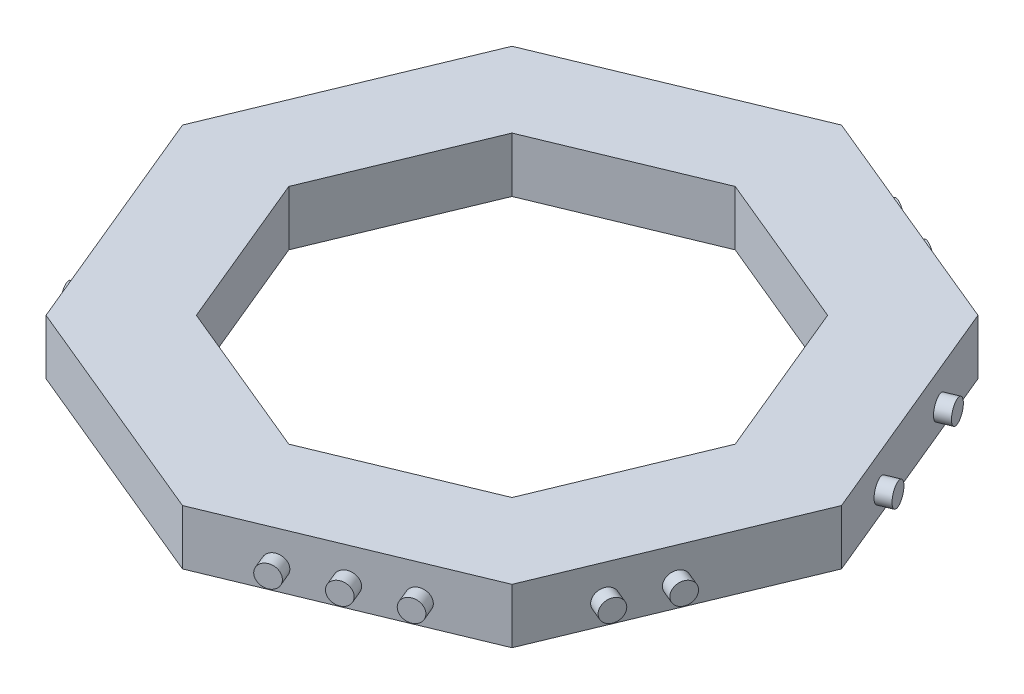
ISO-10303-21;
HEADER;
FILE_DESCRIPTION(('STEP AP214'),'2;1');
FILE_NAME('part.step','',(''),(''),'','','');
FILE_SCHEMA(('AUTOMOTIVE_DESIGN { 1 0 10303 214 1 1 1 1 }'));
ENDSEC;
DATA;
#1=APPLICATION_CONTEXT('core data for automotive mechanical design processes');
#2=APPLICATION_PROTOCOL_DEFINITION('international standard','automotive_design',2000,#1);
#3=PRODUCT_CONTEXT('',#1,'mechanical');
#4=PRODUCT('Part','Part','',(#3));
#5=PRODUCT_RELATED_PRODUCT_CATEGORY('part','',(#4));
#6=PRODUCT_DEFINITION_FORMATION('','',#4);
#7=PRODUCT_DEFINITION_CONTEXT('part definition',#1,'design');
#8=PRODUCT_DEFINITION('design','',#6,#7);
#9=PRODUCT_DEFINITION_SHAPE('','',#8);
#10=(LENGTH_UNIT() NAMED_UNIT(*) SI_UNIT(.MILLI.,.METRE.));
#11=(NAMED_UNIT(*) PLANE_ANGLE_UNIT() SI_UNIT($,.RADIAN.));
#12=(NAMED_UNIT(*) SI_UNIT($,.STERADIAN.) SOLID_ANGLE_UNIT());
#13=UNCERTAINTY_MEASURE_WITH_UNIT(LENGTH_MEASURE(1.E-05),#10,'distance_accuracy_value','');
#14=(GEOMETRIC_REPRESENTATION_CONTEXT(3) GLOBAL_UNCERTAINTY_ASSIGNED_CONTEXT((#13)) GLOBAL_UNIT_ASSIGNED_CONTEXT((#10,
#11,#12)) REPRESENTATION_CONTEXT('',''));
#15=CARTESIAN_POINT('',(0.,0.,0.));
#16=DIRECTION('',(0.,0.,1.));
#17=DIRECTION('',(1.,0.,0.));
#18=AXIS2_PLACEMENT_3D('',#15,#16,#17);
#19=CARTESIAN_POINT('',(21.2132034355967,5.,21.2132034355962));
#20=DIRECTION('',(-0.923879532511291,0.,-0.38268343236508));
#21=DIRECTION('',(-0.38268343236508,0.,0.923879532511291));
#22=AXIS2_PLACEMENT_3D('',#19,#20,#21);
#23=PLANE('',#22);
#24=CARTESIAN_POINT('',(25.6066017177983,2.,10.6066017177979));
#25=DIRECTION('',(-0.923879532511291,0.,-0.38268343236508));
#26=DIRECTION('',(-0.38268343236508,0.,0.923879532511291));
#27=AXIS2_PLACEMENT_3D('',#24,#25,#26);
#28=CIRCLE('',#27,1.);
#29=CARTESIAN_POINT('',(25.2239182854332,2.,11.5304812503092));
#30=VERTEX_POINT('',#29);
#31=EDGE_CURVE('E11',#30,#30,#28,.F.);
#32=ORIENTED_EDGE('',*,*,#31,.F.);
#33=EDGE_LOOP('',(#32));
#34=FACE_BOUND('',#33,.T.);
#35=CARTESIAN_POINT('',(23.6931845559729,2.,15.2259993803544));
#36=DIRECTION('',(-0.923879532511291,0.,-0.38268343236508));
#37=DIRECTION('',(-0.38268343236508,0.,0.923879532511291));
#38=AXIS2_PLACEMENT_3D('',#35,#36,#37);
#39=CIRCLE('',#38,1.);
#40=CARTESIAN_POINT('',(23.3105011236078,2.,16.1498789128657));
#41=VERTEX_POINT('',#40);
#42=EDGE_CURVE('E40',#41,#41,#39,.F.);
#43=ORIENTED_EDGE('',*,*,#42,.F.);
#44=EDGE_LOOP('',(#43));
#45=FACE_BOUND('',#44,.T.);
#46=DIRECTION('',(0.38268343236508,0.,-0.923879532511291));
#47=VECTOR('',#46,1.);
#48=CARTESIAN_POINT('',(21.2132034355967,0.,21.2132034355962));
#49=LINE('',#48,#47);
#50=CARTESIAN_POINT('',(21.2132034355967,0.,21.2132034355962));
#51=VERTEX_POINT('',#50);
#52=CARTESIAN_POINT('',(30.,0.,-3.27821759239711E-13));
#53=VERTEX_POINT('',#52);
#54=EDGE_CURVE('E205',#51,#53,#49,.T.);
#55=ORIENTED_EDGE('',*,*,#54,.T.);
#56=DIRECTION('',(0.,-1.,0.));
#57=VECTOR('',#56,1.);
#58=CARTESIAN_POINT('',(30.,5.,-3.27821759239711E-13));
#59=LINE('',#58,#57);
#60=CARTESIAN_POINT('',(30.,5.,-3.27821759239711E-13));
#61=VERTEX_POINT('',#60);
#62=EDGE_CURVE('E271',#61,#53,#59,.T.);
#63=ORIENTED_EDGE('',*,*,#62,.F.);
#64=DIRECTION('',(0.38268343236508,0.,-0.923879532511291));
#65=VECTOR('',#64,1.);
#66=CARTESIAN_POINT('',(21.2132034355967,5.,21.2132034355962));
#67=LINE('',#66,#65);
#68=CARTESIAN_POINT('',(21.2132034355967,5.,21.2132034355962));
#69=VERTEX_POINT('',#68);
#70=EDGE_CURVE('E217',#69,#61,#67,.T.);
#71=ORIENTED_EDGE('',*,*,#70,.F.);
#72=DIRECTION('',(0.,-1.,0.));
#73=VECTOR('',#72,1.);
#74=CARTESIAN_POINT('',(21.2132034355967,5.,21.2132034355962));
#75=LINE('',#74,#73);
#76=EDGE_CURVE('E235',#69,#51,#75,.T.);
#77=ORIENTED_EDGE('',*,*,#76,.T.);
#78=EDGE_LOOP('',(#55,#63,#71,#77));
#79=FACE_BOUND('',#78,.T.);
#80=ADVANCED_FACE('F33',(#34,#45,#79),#23,.F.);
#81=CARTESIAN_POINT('',(30.,5.,-3.27821759239711E-13));
#82=DIRECTION('',(-0.923879532511283,0.,0.3826834323651));
#83=DIRECTION('',(0.3826834323651,0.,0.923879532511283));
#84=AXIS2_PLACEMENT_3D('',#81,#82,#83);
#85=PLANE('',#84);
#86=CARTESIAN_POINT('',(23.6931845559726,2.,-15.2259993803549));
#87=DIRECTION('',(-0.923879532511283,0.,0.3826834323651));
#88=DIRECTION('',(0.3826834323651,0.,0.923879532511283));
#89=AXIS2_PLACEMENT_3D('',#86,#87,#88);
#90=CIRCLE('',#89,0.999999999999997);
#91=CARTESIAN_POINT('',(24.0758679883377,2.,-14.3021198478436));
#92=VERTEX_POINT('',#91);
#93=EDGE_CURVE('E301',#92,#92,#90,.F.);
#94=ORIENTED_EDGE('',*,*,#93,.F.);
#95=EDGE_LOOP('',(#94));
#96=FACE_BOUND('',#95,.T.);
#97=CARTESIAN_POINT('',(27.5200188796236,2.,-5.98720405524208));
#98=DIRECTION('',(-0.923879532511283,0.,0.3826834323651));
#99=DIRECTION('',(0.3826834323651,0.,0.923879532511283));
#100=AXIS2_PLACEMENT_3D('',#97,#98,#99);
#101=CIRCLE('',#100,1.);
#102=CARTESIAN_POINT('',(27.9027023119887,2.,-5.0633245227308));
#103=VERTEX_POINT('',#102);
#104=EDGE_CURVE('E298',#103,#103,#101,.F.);
#105=ORIENTED_EDGE('',*,*,#104,.F.);
#106=EDGE_LOOP('',(#105));
#107=FACE_BOUND('',#106,.T.);
#108=DIRECTION('',(-0.3826834323651,0.,-0.923879532511283));
#109=VECTOR('',#108,1.);
#110=CARTESIAN_POINT('',(30.,0.,-3.27821759239711E-13));
#111=LINE('',#110,#109);
#112=CARTESIAN_POINT('',(21.2132034355962,0.,-21.2132034355967));
#113=VERTEX_POINT('',#112);
#114=EDGE_CURVE('E238',#53,#113,#111,.T.);
#115=ORIENTED_EDGE('',*,*,#114,.T.);
#116=DIRECTION('',(0.,-1.,0.));
#117=VECTOR('',#116,1.);
#118=CARTESIAN_POINT('',(21.2132034355962,5.,-21.2132034355967));
#119=LINE('',#118,#117);
#120=CARTESIAN_POINT('',(21.2132034355962,5.,-21.2132034355967));
#121=VERTEX_POINT('',#120);
#122=EDGE_CURVE('E268',#121,#113,#119,.T.);
#123=ORIENTED_EDGE('',*,*,#122,.F.);
#124=DIRECTION('',(-0.3826834323651,0.,-0.923879532511283));
#125=VECTOR('',#124,1.);
#126=CARTESIAN_POINT('',(30.,5.,-3.27821759239711E-13));
#127=LINE('',#126,#125);
#128=EDGE_CURVE('E220',#61,#121,#127,.T.);
#129=ORIENTED_EDGE('',*,*,#128,.F.);
#130=ORIENTED_EDGE('',*,*,#62,.T.);
#131=EDGE_LOOP('',(#115,#123,#129,#130));
#132=FACE_BOUND('',#131,.T.);
#133=ADVANCED_FACE('F310',(#96,#107,#132),#85,.F.);
#134=CARTESIAN_POINT('',(21.2132034355962,5.,-21.2132034355967));
#135=DIRECTION('',(-0.382683432365079,0.,0.923879532511291));
#136=DIRECTION('',(0.923879532511291,0.,0.382683432365079));
#137=AXIS2_PLACEMENT_3D('',#134,#135,#136);
#138=PLANE('',#137);
#139=CARTESIAN_POINT('',(5.98720405524147,2.,-27.5200188796237));
#140=DIRECTION('',(-0.382683432365079,0.,0.923879532511291));
#141=DIRECTION('',(0.923879532511291,0.,0.382683432365079));
#142=AXIS2_PLACEMENT_3D('',#139,#140,#141);
#143=CIRCLE('',#142,1.);
#144=CARTESIAN_POINT('',(6.91108358775277,2.,-27.1373354472587));
#145=VERTEX_POINT('',#144);
#146=EDGE_CURVE('E295',#145,#145,#143,.F.);
#147=ORIENTED_EDGE('',*,*,#146,.F.);
#148=EDGE_LOOP('',(#147));
#149=FACE_BOUND('',#148,.T.);
#150=CARTESIAN_POINT('',(10.6066017177979,2.,-25.6066017177983));
#151=DIRECTION('',(-0.382683432365079,0.,0.923879532511291));
#152=DIRECTION('',(0.923879532511291,0.,0.382683432365079));
#153=AXIS2_PLACEMENT_3D('',#150,#151,#152);
#154=CIRCLE('',#153,1.);
#155=CARTESIAN_POINT('',(11.5304812503092,2.,-25.2239182854333));
#156=VERTEX_POINT('',#155);
#157=EDGE_CURVE('E292',#156,#156,#154,.F.);
#158=ORIENTED_EDGE('',*,*,#157,.F.);
#159=EDGE_LOOP('',(#158));
#160=FACE_BOUND('',#159,.T.);
#161=DIRECTION('',(-0.923879532511291,0.,-0.382683432365079));
#162=VECTOR('',#161,1.);
#163=CARTESIAN_POINT('',(21.2132034355962,0.,-21.2132034355967));
#164=LINE('',#163,#162);
#165=CARTESIAN_POINT('',(-3.33810454257589E-13,0.,-30.));
#166=VERTEX_POINT('',#165);
#167=EDGE_CURVE('E240',#113,#166,#164,.T.);
#168=ORIENTED_EDGE('',*,*,#167,.T.);
#169=DIRECTION('',(0.,-1.,0.));
#170=VECTOR('',#169,1.);
#171=CARTESIAN_POINT('',(-3.33810454257589E-13,5.,-30.));
#172=LINE('',#171,#170);
#173=CARTESIAN_POINT('',(-3.33810454257589E-13,5.,-30.));
#174=VERTEX_POINT('',#173);
#175=EDGE_CURVE('E265',#174,#166,#172,.T.);
#176=ORIENTED_EDGE('',*,*,#175,.F.);
#177=DIRECTION('',(-0.923879532511291,0.,-0.382683432365079));
#178=VECTOR('',#177,1.);
#179=CARTESIAN_POINT('',(21.2132034355962,5.,-21.2132034355967));
#180=LINE('',#179,#178);
#181=EDGE_CURVE('E223',#121,#174,#180,.T.);
#182=ORIENTED_EDGE('',*,*,#181,.F.);
#183=ORIENTED_EDGE('',*,*,#122,.T.);
#184=EDGE_LOOP('',(#168,#176,#182,#183));
#185=FACE_BOUND('',#184,.T.);
#186=ADVANCED_FACE('F348',(#149,#160,#185),#138,.F.);
#187=CARTESIAN_POINT('',(-3.33810454257589E-13,5.,-30.));
#188=DIRECTION('',(0.3826834323651,0.,0.923879532511283));
#189=DIRECTION('',(0.923879532511283,0.,-0.3826834323651));
#190=AXIS2_PLACEMENT_3D('',#187,#188,#189);
#191=PLANE('',#190);
#192=CARTESIAN_POINT('',(-5.98720405524208,2.,-27.5200188796236));
#193=DIRECTION('',(0.3826834323651,0.,0.923879532511283));
#194=DIRECTION('',(0.923879532511283,0.,-0.3826834323651));
#195=AXIS2_PLACEMENT_3D('',#192,#193,#194);
#196=CIRCLE('',#195,1.);
#197=CARTESIAN_POINT('',(-5.06332452273079,2.,-27.9027023119887));
#198=VERTEX_POINT('',#197);
#199=EDGE_CURVE('E289',#198,#198,#196,.F.);
#200=ORIENTED_EDGE('',*,*,#199,.F.);
#201=EDGE_LOOP('',(#200));
#202=FACE_BOUND('',#201,.T.);
#203=DIRECTION('',(-0.923879532511283,0.,0.3826834323651));
#204=VECTOR('',#203,1.);
#205=CARTESIAN_POINT('',(-3.33810454257589E-13,0.,-30.));
#206=LINE('',#205,#204);
#207=CARTESIAN_POINT('',(-21.2132034355967,0.,-21.2132034355962));
#208=VERTEX_POINT('',#207);
#209=EDGE_CURVE('E242',#166,#208,#206,.T.);
#210=ORIENTED_EDGE('',*,*,#209,.T.);
#211=DIRECTION('',(0.,-1.,0.));
#212=VECTOR('',#211,1.);
#213=CARTESIAN_POINT('',(-21.2132034355967,5.,-21.2132034355962));
#214=LINE('',#213,#212);
#215=CARTESIAN_POINT('',(-21.2132034355967,5.,-21.2132034355962));
#216=VERTEX_POINT('',#215);
#217=EDGE_CURVE('E262',#216,#208,#214,.T.);
#218=ORIENTED_EDGE('',*,*,#217,.F.);
#219=DIRECTION('',(-0.923879532511283,0.,0.3826834323651));
#220=VECTOR('',#219,1.);
#221=CARTESIAN_POINT('',(-3.33810454257589E-13,5.,-30.));
#222=LINE('',#221,#220);
#223=EDGE_CURVE('E225',#174,#216,#222,.T.);
#224=ORIENTED_EDGE('',*,*,#223,.F.);
#225=ORIENTED_EDGE('',*,*,#175,.T.);
#226=EDGE_LOOP('',(#210,#218,#224,#225));
#227=FACE_BOUND('',#226,.T.);
#228=ADVANCED_FACE('F345',(#202,#227),#191,.F.);
#229=CARTESIAN_POINT('',(-21.2132034355967,5.,-21.2132034355962));
#230=DIRECTION('',(0.923879532511291,0.,0.382683432365079));
#231=DIRECTION('',(0.382683432365079,0.,-0.923879532511291));
#232=AXIS2_PLACEMENT_3D('',#229,#230,#231);
#233=PLANE('',#232);
#234=CARTESIAN_POINT('',(-25.6066017177983,2.,-10.6066017177979));
#235=DIRECTION('',(0.923879532511291,0.,0.382683432365079));
#236=DIRECTION('',(0.382683432365079,0.,-0.923879532511291));
#237=AXIS2_PLACEMENT_3D('',#234,#235,#236);
#238=CIRCLE('',#237,1.);
#239=CARTESIAN_POINT('',(-25.2239182854333,2.,-11.5304812503092));
#240=VERTEX_POINT('',#239);
#241=EDGE_CURVE('E286',#240,#240,#238,.F.);
#242=ORIENTED_EDGE('',*,*,#241,.F.);
#243=EDGE_LOOP('',(#242));
#244=FACE_BOUND('',#243,.T.);
#245=DIRECTION('',(-0.382683432365079,0.,0.923879532511291));
#246=VECTOR('',#245,1.);
#247=CARTESIAN_POINT('',(-21.2132034355967,0.,-21.2132034355962));
#248=LINE('',#247,#246);
#249=CARTESIAN_POINT('',(-30.,0.,3.22876543822151E-13));
#250=VERTEX_POINT('',#249);
#251=EDGE_CURVE('E244',#208,#250,#248,.T.);
#252=ORIENTED_EDGE('',*,*,#251,.T.);
#253=DIRECTION('',(0.,-1.,0.));
#254=VECTOR('',#253,1.);
#255=CARTESIAN_POINT('',(-30.,5.,3.22876543822151E-13));
#256=LINE('',#255,#254);
#257=CARTESIAN_POINT('',(-30.,5.,3.22876543822151E-13));
#258=VERTEX_POINT('',#257);
#259=EDGE_CURVE('E259',#258,#250,#256,.T.);
#260=ORIENTED_EDGE('',*,*,#259,.F.);
#261=DIRECTION('',(-0.382683432365079,0.,0.923879532511291));
#262=VECTOR('',#261,1.);
#263=CARTESIAN_POINT('',(-21.2132034355967,5.,-21.2132034355962));
#264=LINE('',#263,#262);
#265=EDGE_CURVE('E227',#216,#258,#264,.T.);
#266=ORIENTED_EDGE('',*,*,#265,.F.);
#267=ORIENTED_EDGE('',*,*,#217,.T.);
#268=EDGE_LOOP('',(#252,#260,#266,#267));
#269=FACE_BOUND('',#268,.T.);
#270=ADVANCED_FACE('F341',(#244,#269),#233,.F.);
#271=CARTESIAN_POINT('',(-30.,5.,3.22876543822151E-13));
#272=DIRECTION('',(0.923879532511283,0.,-0.3826834323651));
#273=DIRECTION('',(-0.3826834323651,0.,-0.923879532511283));
#274=AXIS2_PLACEMENT_3D('',#271,#272,#273);
#275=PLANE('',#274);
#276=CARTESIAN_POINT('',(-23.6931845559726,2.,15.2259993803549));
#277=DIRECTION('',(0.923879532511283,0.,-0.3826834323651));
#278=DIRECTION('',(-0.3826834323651,0.,-0.923879532511283));
#279=AXIS2_PLACEMENT_3D('',#276,#277,#278);
#280=CIRCLE('',#279,1.);
#281=CARTESIAN_POINT('',(-24.0758679883377,2.,14.3021198478436));
#282=VERTEX_POINT('',#281);
#283=EDGE_CURVE('E283',#282,#282,#280,.F.);
#284=ORIENTED_EDGE('',*,*,#283,.F.);
#285=EDGE_LOOP('',(#284));
#286=FACE_BOUND('',#285,.T.);
#287=DIRECTION('',(0.3826834323651,0.,0.923879532511283));
#288=VECTOR('',#287,1.);
#289=CARTESIAN_POINT('',(-30.,0.,3.22876543822151E-13));
#290=LINE('',#289,#288);
#291=CARTESIAN_POINT('',(-21.2132034355962,0.,21.2132034355967));
#292=VERTEX_POINT('',#291);
#293=EDGE_CURVE('E246',#250,#292,#290,.T.);
#294=ORIENTED_EDGE('',*,*,#293,.T.);
#295=DIRECTION('',(0.,-1.,0.));
#296=VECTOR('',#295,1.);
#297=CARTESIAN_POINT('',(-21.2132034355962,5.,21.2132034355967));
#298=LINE('',#297,#296);
#299=CARTESIAN_POINT('',(-21.2132034355962,5.,21.2132034355967));
#300=VERTEX_POINT('',#299);
#301=EDGE_CURVE('E256',#300,#292,#298,.T.);
#302=ORIENTED_EDGE('',*,*,#301,.F.);
#303=DIRECTION('',(0.3826834323651,0.,0.923879532511283));
#304=VECTOR('',#303,1.);
#305=CARTESIAN_POINT('',(-30.,5.,3.22876543822151E-13));
#306=LINE('',#305,#304);
#307=EDGE_CURVE('E229',#258,#300,#306,.T.);
#308=ORIENTED_EDGE('',*,*,#307,.F.);
#309=ORIENTED_EDGE('',*,*,#259,.T.);
#310=EDGE_LOOP('',(#294,#302,#308,#309));
#311=FACE_BOUND('',#310,.T.);
#312=ADVANCED_FACE('F336',(#286,#311),#275,.F.);
#313=CARTESIAN_POINT('',(-21.2132034355962,5.,21.2132034355967));
#314=DIRECTION('',(0.382683432365079,0.,-0.923879532511291));
#315=DIRECTION('',(-0.923879532511291,0.,-0.382683432365079));
#316=AXIS2_PLACEMENT_3D('',#313,#314,#315);
#317=PLANE('',#316);
#318=DIRECTION('',(0.923879532511291,0.,0.382683432365079));
#319=VECTOR('',#318,1.);
#320=CARTESIAN_POINT('',(-21.2132034355962,0.,21.2132034355967));
#321=LINE('',#320,#319);
#322=CARTESIAN_POINT('',(3.27990907207669E-13,0.,30.));
#323=VERTEX_POINT('',#322);
#324=EDGE_CURVE('E248',#292,#323,#321,.T.);
#325=ORIENTED_EDGE('',*,*,#324,.T.);
#326=DIRECTION('',(0.,-1.,0.));
#327=VECTOR('',#326,1.);
#328=CARTESIAN_POINT('',(3.27990907207669E-13,5.,30.));
#329=LINE('',#328,#327);
#330=CARTESIAN_POINT('',(3.27990907207669E-13,5.,30.));
#331=VERTEX_POINT('',#330);
#332=EDGE_CURVE('E253',#331,#323,#329,.T.);
#333=ORIENTED_EDGE('',*,*,#332,.F.);
#334=DIRECTION('',(0.923879532511291,0.,0.382683432365079));
#335=VECTOR('',#334,1.);
#336=CARTESIAN_POINT('',(-21.2132034355962,5.,21.2132034355967));
#337=LINE('',#336,#335);
#338=EDGE_CURVE('E231',#300,#331,#337,.T.);
#339=ORIENTED_EDGE('',*,*,#338,.F.);
#340=ORIENTED_EDGE('',*,*,#301,.T.);
#341=EDGE_LOOP('',(#325,#333,#339,#340));
#342=FACE_BOUND('',#341,.T.);
#343=ADVANCED_FACE('F331',(#342),#317,.F.);
#344=CARTESIAN_POINT('',(3.27990907207669E-13,5.,30.));
#345=DIRECTION('',(-0.3826834323651,0.,-0.923879532511283));
#346=DIRECTION('',(-0.923879532511283,0.,0.3826834323651));
#347=AXIS2_PLACEMENT_3D('',#344,#345,#346);
#348=PLANE('',#347);
#349=CARTESIAN_POINT('',(10.6066017177985,2.,25.6066017177981));
#350=DIRECTION('',(-0.3826834323651,0.,-0.923879532511283));
#351=DIRECTION('',(-0.923879532511283,0.,0.3826834323651));
#352=AXIS2_PLACEMENT_3D('',#349,#350,#351);
#353=CIRCLE('',#352,1.);
#354=CARTESIAN_POINT('',(9.6827221852872,2.,25.9892851501632));
#355=VERTEX_POINT('',#354);
#356=EDGE_CURVE('E280',#355,#355,#353,.F.);
#357=ORIENTED_EDGE('',*,*,#356,.F.);
#358=EDGE_LOOP('',(#357));
#359=FACE_BOUND('',#358,.T.);
#360=CARTESIAN_POINT('',(5.98720405524207,2.,27.5200188796236));
#361=DIRECTION('',(-0.3826834323651,0.,-0.923879532511283));
#362=DIRECTION('',(-0.923879532511283,0.,0.3826834323651));
#363=AXIS2_PLACEMENT_3D('',#360,#361,#362);
#364=CIRCLE('',#363,1.);
#365=CARTESIAN_POINT('',(5.06332452273079,2.,27.9027023119887));
#366=VERTEX_POINT('',#365);
#367=EDGE_CURVE('E277',#366,#366,#364,.F.);
#368=ORIENTED_EDGE('',*,*,#367,.F.);
#369=EDGE_LOOP('',(#368));
#370=FACE_BOUND('',#369,.T.);
#371=CARTESIAN_POINT('',(15.2259993803549,2.,23.6931845559726));
#372=DIRECTION('',(-0.3826834323651,0.,-0.923879532511283));
#373=DIRECTION('',(-0.923879532511283,0.,0.3826834323651));
#374=AXIS2_PLACEMENT_3D('',#371,#372,#373);
#375=CIRCLE('',#374,0.999999999999997);
#376=CARTESIAN_POINT('',(14.3021198478436,2.,24.0758679883377));
#377=VERTEX_POINT('',#376);
#378=EDGE_CURVE('E274',#377,#377,#375,.F.);
#379=ORIENTED_EDGE('',*,*,#378,.F.);
#380=EDGE_LOOP('',(#379));
#381=FACE_BOUND('',#380,.T.);
#382=DIRECTION('',(0.923879532511283,0.,-0.3826834323651));
#383=VECTOR('',#382,1.);
#384=CARTESIAN_POINT('',(3.27990907207669E-13,0.,30.));
#385=LINE('',#384,#383);
#386=EDGE_CURVE('E221',#323,#51,#385,.T.);
#387=ORIENTED_EDGE('',*,*,#386,.T.);
#388=ORIENTED_EDGE('',*,*,#76,.F.);
#389=DIRECTION('',(0.923879532511283,0.,-0.3826834323651));
#390=VECTOR('',#389,1.);
#391=CARTESIAN_POINT('',(3.27990907207669E-13,5.,30.));
#392=LINE('',#391,#390);
#393=EDGE_CURVE('E233',#331,#69,#392,.T.);
#394=ORIENTED_EDGE('',*,*,#393,.F.);
#395=ORIENTED_EDGE('',*,*,#332,.T.);
#396=EDGE_LOOP('',(#387,#388,#394,#395));
#397=FACE_BOUND('',#396,.T.);
#398=ADVANCED_FACE('F329',(#359,#370,#381,#397),#348,.F.);
#399=CARTESIAN_POINT('',(0.,5.,0.));
#400=DIRECTION('',(0.,1.,0.));
#401=DIRECTION('',(0.,0.,1.));
#402=AXIS2_PLACEMENT_3D('',#399,#400,#401);
#403=PLANE('',#402);
#404=DIRECTION('',(0.382683432365079,0.,-0.923879532511291));
#405=VECTOR('',#404,1.);
#406=CARTESIAN_POINT('',(14.3684097937108,5.,14.3684097937105));
#407=LINE('',#406,#405);
#408=CARTESIAN_POINT('',(14.3684097937108,5.,14.3684097937105));
#409=VERTEX_POINT('',#408);
#410=CARTESIAN_POINT('',(20.32,5.,-2.38524477946811E-13));
#411=VERTEX_POINT('',#410);
#412=EDGE_CURVE('E47',#409,#411,#407,.T.);
#413=ORIENTED_EDGE('',*,*,#412,.F.);
#414=DIRECTION('',(0.923879532511282,0.,-0.3826834323651));
#415=VECTOR('',#414,1.);
#416=CARTESIAN_POINT('',(2.40678638717616E-13,5.,20.32));
#417=LINE('',#416,#415);
#418=CARTESIAN_POINT('',(2.40678638717616E-13,5.,20.32));
#419=VERTEX_POINT('',#418);
#420=EDGE_CURVE('E164',#419,#409,#417,.T.);
#421=ORIENTED_EDGE('',*,*,#420,.F.);
#422=DIRECTION('',(0.923879532511291,0.,0.382683432365079));
#423=VECTOR('',#422,1.);
#424=CARTESIAN_POINT('',(-14.3684097937105,5.,14.3684097937108));
#425=LINE('',#424,#423);
#426=CARTESIAN_POINT('',(-14.3684097937105,5.,14.3684097937108));
#427=VERTEX_POINT('',#426);
#428=EDGE_CURVE('E167',#427,#419,#425,.T.);
#429=ORIENTED_EDGE('',*,*,#428,.F.);
#430=DIRECTION('',(0.3826834323651,0.,0.923879532511282));
#431=VECTOR('',#430,1.);
#432=CARTESIAN_POINT('',(-20.32,5.,2.42729561305328E-13));
#433=LINE('',#432,#431);
#434=CARTESIAN_POINT('',(-20.32,5.,2.42729561305328E-13));
#435=VERTEX_POINT('',#434);
#436=EDGE_CURVE('E198',#435,#427,#433,.T.);
#437=ORIENTED_EDGE('',*,*,#436,.F.);
#438=DIRECTION('',(-0.382683432365079,0.,0.923879532511291));
#439=VECTOR('',#438,1.);
#440=CARTESIAN_POINT('',(-14.3684097937108,5.,-14.3684097937105));
#441=LINE('',#440,#439);
#442=CARTESIAN_POINT('',(-14.3684097937108,5.,-14.3684097937105));
#443=VERTEX_POINT('',#442);
#444=EDGE_CURVE('E195',#443,#435,#441,.T.);
#445=ORIENTED_EDGE('',*,*,#444,.F.);
#446=DIRECTION('',(-0.923879532511282,0.,0.3826834323651));
#447=VECTOR('',#446,1.);
#448=CARTESIAN_POINT('',(-2.42838850685979E-13,5.,-20.32));
#449=LINE('',#448,#447);
#450=CARTESIAN_POINT('',(-2.42838850685979E-13,5.,-20.32));
#451=VERTEX_POINT('',#450);
#452=EDGE_CURVE('E192',#451,#443,#449,.T.);
#453=ORIENTED_EDGE('',*,*,#452,.F.);
#454=DIRECTION('',(-0.923879532511291,0.,-0.382683432365079));
#455=VECTOR('',#454,1.);
#456=CARTESIAN_POINT('',(14.3684097937105,5.,-14.3684097937108));
#457=LINE('',#456,#455);
#458=CARTESIAN_POINT('',(14.3684097937105,5.,-14.3684097937108));
#459=VERTEX_POINT('',#458);
#460=EDGE_CURVE('E189',#459,#451,#457,.T.);
#461=ORIENTED_EDGE('',*,*,#460,.F.);
#462=DIRECTION('',(-0.382683432365101,0.,-0.923879532511282));
#463=VECTOR('',#462,1.);
#464=CARTESIAN_POINT('',(20.32,5.,-2.3879865158925E-13));
#465=LINE('',#464,#463);
#466=EDGE_CURVE('E187',#411,#459,#465,.T.);
#467=ORIENTED_EDGE('',*,*,#466,.F.);
#468=EDGE_LOOP('',(#413,#421,#429,#437,#445,#453,#461,#467));
#469=FACE_BOUND('',#468,.T.);
#470=ORIENTED_EDGE('',*,*,#70,.T.);
#471=ORIENTED_EDGE('',*,*,#128,.T.);
#472=ORIENTED_EDGE('',*,*,#181,.T.);
#473=ORIENTED_EDGE('',*,*,#223,.T.);
#474=ORIENTED_EDGE('',*,*,#265,.T.);
#475=ORIENTED_EDGE('',*,*,#307,.T.);
#476=ORIENTED_EDGE('',*,*,#338,.T.);
#477=ORIENTED_EDGE('',*,*,#393,.T.);
#478=EDGE_LOOP('',(#470,#471,#472,#473,#474,#475,#476,#477));
#479=FACE_BOUND('',#478,.T.);
#480=ADVANCED_FACE('F324',(#469,#479),#403,.T.);
#481=CARTESIAN_POINT('',(0.,0.,0.));
#482=DIRECTION('',(0.,1.,0.));
#483=DIRECTION('',(0.,0.,1.));
#484=AXIS2_PLACEMENT_3D('',#481,#482,#483);
#485=PLANE('',#484);
#486=DIRECTION('',(0.923879532511282,0.,-0.3826834323651));
#487=VECTOR('',#486,1.);
#488=CARTESIAN_POINT('',(2.40678638717616E-13,0.,20.32));
#489=LINE('',#488,#487);
#490=CARTESIAN_POINT('',(2.40678638717616E-13,0.,20.32));
#491=VERTEX_POINT('',#490);
#492=CARTESIAN_POINT('',(14.3684097937108,0.,14.3684097937105));
#493=VERTEX_POINT('',#492);
#494=EDGE_CURVE('E153',#491,#493,#489,.T.);
#495=ORIENTED_EDGE('',*,*,#494,.T.);
#496=DIRECTION('',(0.382683432365079,0.,-0.923879532511291));
#497=VECTOR('',#496,1.);
#498=CARTESIAN_POINT('',(14.3684097937108,0.,14.3684097937105));
#499=LINE('',#498,#497);
#500=CARTESIAN_POINT('',(20.32,0.,-2.3879865158925E-13));
#501=VERTEX_POINT('',#500);
#502=EDGE_CURVE('E147',#493,#501,#499,.T.);
#503=ORIENTED_EDGE('',*,*,#502,.T.);
#504=DIRECTION('',(-0.382683432365101,0.,-0.923879532511282));
#505=VECTOR('',#504,1.);
#506=CARTESIAN_POINT('',(20.32,0.,-2.3879865158925E-13));
#507=LINE('',#506,#505);
#508=CARTESIAN_POINT('',(14.3684097937105,0.,-14.3684097937108));
#509=VERTEX_POINT('',#508);
#510=EDGE_CURVE('E156',#501,#509,#507,.T.);
#511=ORIENTED_EDGE('',*,*,#510,.T.);
#512=DIRECTION('',(-0.923879532511291,0.,-0.382683432365079));
#513=VECTOR('',#512,1.);
#514=CARTESIAN_POINT('',(14.3684097937105,0.,-14.3684097937108));
#515=LINE('',#514,#513);
#516=CARTESIAN_POINT('',(-2.42838850685979E-13,0.,-20.32));
#517=VERTEX_POINT('',#516);
#518=EDGE_CURVE('E55',#509,#517,#515,.T.);
#519=ORIENTED_EDGE('',*,*,#518,.T.);
#520=DIRECTION('',(-0.923879532511282,0.,0.3826834323651));
#521=VECTOR('',#520,1.);
#522=CARTESIAN_POINT('',(-2.42838850685979E-13,0.,-20.32));
#523=LINE('',#522,#521);
#524=CARTESIAN_POINT('',(-14.3684097937108,0.,-14.3684097937105));
#525=VERTEX_POINT('',#524);
#526=EDGE_CURVE('E174',#517,#525,#523,.T.);
#527=ORIENTED_EDGE('',*,*,#526,.T.);
#528=DIRECTION('',(-0.382683432365079,0.,0.923879532511291));
#529=VECTOR('',#528,1.);
#530=CARTESIAN_POINT('',(-14.3684097937108,0.,-14.3684097937105));
#531=LINE('',#530,#529);
#532=CARTESIAN_POINT('',(-20.32,0.,2.42729561305328E-13));
#533=VERTEX_POINT('',#532);
#534=EDGE_CURVE('E177',#525,#533,#531,.T.);
#535=ORIENTED_EDGE('',*,*,#534,.T.);
#536=DIRECTION('',(0.3826834323651,0.,0.923879532511282));
#537=VECTOR('',#536,1.);
#538=CARTESIAN_POINT('',(-20.32,0.,2.42729561305328E-13));
#539=LINE('',#538,#537);
#540=CARTESIAN_POINT('',(-14.3684097937105,0.,14.3684097937108));
#541=VERTEX_POINT('',#540);
#542=EDGE_CURVE('E180',#533,#541,#539,.T.);
#543=ORIENTED_EDGE('',*,*,#542,.T.);
#544=DIRECTION('',(0.923879532511291,0.,0.382683432365079));
#545=VECTOR('',#544,1.);
#546=CARTESIAN_POINT('',(-14.3684097937105,0.,14.3684097937108));
#547=LINE('',#546,#545);
#548=EDGE_CURVE('E183',#541,#491,#547,.T.);
#549=ORIENTED_EDGE('',*,*,#548,.T.);
#550=EDGE_LOOP('',(#495,#503,#511,#519,#527,#535,#543,#549));
#551=FACE_BOUND('',#550,.T.);
#552=ORIENTED_EDGE('',*,*,#54,.F.);
#553=ORIENTED_EDGE('',*,*,#386,.F.);
#554=ORIENTED_EDGE('',*,*,#324,.F.);
#555=ORIENTED_EDGE('',*,*,#293,.F.);
#556=ORIENTED_EDGE('',*,*,#251,.F.);
#557=ORIENTED_EDGE('',*,*,#209,.F.);
#558=ORIENTED_EDGE('',*,*,#167,.F.);
#559=ORIENTED_EDGE('',*,*,#114,.F.);
#560=EDGE_LOOP('',(#552,#553,#554,#555,#556,#557,#558,#559));
#561=FACE_BOUND('',#560,.T.);
#562=ADVANCED_FACE('F160',(#551,#561),#485,.F.);
#563=CARTESIAN_POINT('',(14.3684097937108,0.,14.3684097937105));
#564=DIRECTION('',(0.923879532511291,0.,0.382683432365079));
#565=DIRECTION('',(0.382683432365079,0.,-0.923879532511291));
#566=AXIS2_PLACEMENT_3D('',#563,#564,#565);
#567=PLANE('',#566);
#568=ORIENTED_EDGE('',*,*,#412,.T.);
#569=DIRECTION('',(0.,1.,0.));
#570=VECTOR('',#569,1.);
#571=CARTESIAN_POINT('',(20.32,0.,-2.3879865158925E-13));
#572=LINE('',#571,#570);
#573=EDGE_CURVE('E143',#501,#411,#572,.T.);
#574=ORIENTED_EDGE('',*,*,#573,.F.);
#575=ORIENTED_EDGE('',*,*,#502,.F.);
#576=DIRECTION('',(0.,1.,0.));
#577=VECTOR('',#576,1.);
#578=CARTESIAN_POINT('',(14.3684097937108,0.,14.3684097937105));
#579=LINE('',#578,#577);
#580=EDGE_CURVE('E203',#493,#409,#579,.T.);
#581=ORIENTED_EDGE('',*,*,#580,.T.);
#582=EDGE_LOOP('',(#568,#574,#575,#581));
#583=FACE_BOUND('',#582,.T.);
#584=ADVANCED_FACE('F145',(#583),#567,.F.);
#585=CARTESIAN_POINT('',(2.40678638717616E-13,0.,20.32));
#586=DIRECTION('',(0.3826834323651,0.,0.923879532511282));
#587=DIRECTION('',(0.923879532511282,0.,-0.3826834323651));
#588=AXIS2_PLACEMENT_3D('',#585,#586,#587);
#589=PLANE('',#588);
#590=ORIENTED_EDGE('',*,*,#420,.T.);
#591=ORIENTED_EDGE('',*,*,#580,.F.);
#592=ORIENTED_EDGE('',*,*,#494,.F.);
#593=DIRECTION('',(0.,1.,0.));
#594=VECTOR('',#593,1.);
#595=CARTESIAN_POINT('',(2.40678638717616E-13,0.,20.32));
#596=LINE('',#595,#594);
#597=EDGE_CURVE('E206',#491,#419,#596,.T.);
#598=ORIENTED_EDGE('',*,*,#597,.T.);
#599=EDGE_LOOP('',(#590,#591,#592,#598));
#600=FACE_BOUND('',#599,.T.);
#601=ADVANCED_FACE('F380',(#600),#589,.F.);
#602=CARTESIAN_POINT('',(-14.3684097937105,0.,14.3684097937108));
#603=DIRECTION('',(-0.382683432365079,0.,0.923879532511291));
#604=DIRECTION('',(0.923879532511291,0.,0.382683432365079));
#605=AXIS2_PLACEMENT_3D('',#602,#603,#604);
#606=PLANE('',#605);
#607=ORIENTED_EDGE('',*,*,#428,.T.);
#608=ORIENTED_EDGE('',*,*,#597,.F.);
#609=ORIENTED_EDGE('',*,*,#548,.F.);
#610=DIRECTION('',(0.,1.,0.));
#611=VECTOR('',#610,1.);
#612=CARTESIAN_POINT('',(-14.3684097937105,0.,14.3684097937108));
#613=LINE('',#612,#611);
#614=EDGE_CURVE('E208',#541,#427,#613,.T.);
#615=ORIENTED_EDGE('',*,*,#614,.T.);
#616=EDGE_LOOP('',(#607,#608,#609,#615));
#617=FACE_BOUND('',#616,.T.);
#618=ADVANCED_FACE('F398',(#617),#606,.F.);
#619=CARTESIAN_POINT('',(-20.32,0.,2.42729561305328E-13));
#620=DIRECTION('',(-0.923879532511282,0.,0.3826834323651));
#621=DIRECTION('',(0.3826834323651,0.,0.923879532511282));
#622=AXIS2_PLACEMENT_3D('',#619,#620,#621);
#623=PLANE('',#622);
#624=ORIENTED_EDGE('',*,*,#436,.T.);
#625=ORIENTED_EDGE('',*,*,#614,.F.);
#626=ORIENTED_EDGE('',*,*,#542,.F.);
#627=DIRECTION('',(0.,1.,0.));
#628=VECTOR('',#627,1.);
#629=CARTESIAN_POINT('',(-20.32,0.,2.42729561305328E-13));
#630=LINE('',#629,#628);
#631=EDGE_CURVE('E210',#533,#435,#630,.T.);
#632=ORIENTED_EDGE('',*,*,#631,.T.);
#633=EDGE_LOOP('',(#624,#625,#626,#632));
#634=FACE_BOUND('',#633,.T.);
#635=ADVANCED_FACE('F394',(#634),#623,.F.);
#636=CARTESIAN_POINT('',(-14.3684097937108,0.,-14.3684097937105));
#637=DIRECTION('',(-0.923879532511291,0.,-0.382683432365079));
#638=DIRECTION('',(-0.382683432365079,0.,0.923879532511291));
#639=AXIS2_PLACEMENT_3D('',#636,#637,#638);
#640=PLANE('',#639);
#641=ORIENTED_EDGE('',*,*,#444,.T.);
#642=ORIENTED_EDGE('',*,*,#631,.F.);
#643=ORIENTED_EDGE('',*,*,#534,.F.);
#644=DIRECTION('',(0.,1.,0.));
#645=VECTOR('',#644,1.);
#646=CARTESIAN_POINT('',(-14.3684097937108,0.,-14.3684097937105));
#647=LINE('',#646,#645);
#648=EDGE_CURVE('E212',#525,#443,#647,.T.);
#649=ORIENTED_EDGE('',*,*,#648,.T.);
#650=EDGE_LOOP('',(#641,#642,#643,#649));
#651=FACE_BOUND('',#650,.T.);
#652=ADVANCED_FACE('F390',(#651),#640,.F.);
#653=CARTESIAN_POINT('',(-2.42838850685979E-13,0.,-20.32));
#654=DIRECTION('',(-0.3826834323651,0.,-0.923879532511282));
#655=DIRECTION('',(-0.923879532511282,0.,0.3826834323651));
#656=AXIS2_PLACEMENT_3D('',#653,#654,#655);
#657=PLANE('',#656);
#658=ORIENTED_EDGE('',*,*,#452,.T.);
#659=ORIENTED_EDGE('',*,*,#648,.F.);
#660=ORIENTED_EDGE('',*,*,#526,.F.);
#661=DIRECTION('',(0.,1.,0.));
#662=VECTOR('',#661,1.);
#663=CARTESIAN_POINT('',(-2.42838850685979E-13,0.,-20.32));
#664=LINE('',#663,#662);
#665=EDGE_CURVE('E214',#517,#451,#664,.T.);
#666=ORIENTED_EDGE('',*,*,#665,.T.);
#667=EDGE_LOOP('',(#658,#659,#660,#666));
#668=FACE_BOUND('',#667,.T.);
#669=ADVANCED_FACE('F387',(#668),#657,.F.);
#670=CARTESIAN_POINT('',(14.3684097937105,0.,-14.3684097937108));
#671=DIRECTION('',(0.382683432365079,0.,-0.923879532511291));
#672=DIRECTION('',(-0.923879532511291,0.,-0.382683432365079));
#673=AXIS2_PLACEMENT_3D('',#670,#671,#672);
#674=PLANE('',#673);
#675=ORIENTED_EDGE('',*,*,#460,.T.);
#676=ORIENTED_EDGE('',*,*,#665,.F.);
#677=ORIENTED_EDGE('',*,*,#518,.F.);
#678=DIRECTION('',(0.,1.,0.));
#679=VECTOR('',#678,1.);
#680=CARTESIAN_POINT('',(14.3684097937105,0.,-14.3684097937108));
#681=LINE('',#680,#679);
#682=EDGE_CURVE('E152',#509,#459,#681,.T.);
#683=ORIENTED_EDGE('',*,*,#682,.T.);
#684=EDGE_LOOP('',(#675,#676,#677,#683));
#685=FACE_BOUND('',#684,.T.);
#686=ADVANCED_FACE('F384',(#685),#674,.F.);
#687=CARTESIAN_POINT('',(20.32,0.,-2.3879865158925E-13));
#688=DIRECTION('',(0.923879532511282,0.,-0.382683432365101));
#689=DIRECTION('',(-0.382683432365101,0.,-0.923879532511282));
#690=AXIS2_PLACEMENT_3D('',#687,#688,#689);
#691=PLANE('',#690);
#692=ORIENTED_EDGE('',*,*,#466,.T.);
#693=ORIENTED_EDGE('',*,*,#682,.F.);
#694=ORIENTED_EDGE('',*,*,#510,.F.);
#695=ORIENTED_EDGE('',*,*,#573,.T.);
#696=EDGE_LOOP('',(#692,#693,#694,#695));
#697=FACE_BOUND('',#696,.T.);
#698=ADVANCED_FACE('F157',(#697),#691,.F.);
#699=CARTESIAN_POINT('',(15.7043536708113,2.,24.8480339716117));
#700=DIRECTION('',(-0.3826834323651,0.,-0.923879532511283));
#701=DIRECTION('',(-0.923879532511283,0.,0.3826834323651));
#702=AXIS2_PLACEMENT_3D('',#699,#700,#701);
#703=CYLINDRICAL_SURFACE('',#702,0.999999999999997);
#704=CARTESIAN_POINT('',(15.7043536708113,2.,24.8480339716117));
#705=DIRECTION('',(0.3826834323651,0.,0.923879532511283));
#706=DIRECTION('',(0.923879532511283,0.,-0.3826834323651));
#707=AXIS2_PLACEMENT_3D('',#704,#705,#706);
#708=CIRCLE('',#707,0.999999999999997);
#709=CARTESIAN_POINT('',(16.6282332033226,2.,24.4653505392466));
#710=VERTEX_POINT('',#709);
#711=EDGE_CURVE('E170',#710,#710,#708,.T.);
#712=ORIENTED_EDGE('',*,*,#711,.F.);
#713=EDGE_LOOP('',(#712));
#714=FACE_BOUND('',#713,.T.);
#715=ORIENTED_EDGE('',*,*,#378,.T.);
#716=EDGE_LOOP('',(#715));
#717=FACE_BOUND('',#716,.T.);
#718=ADVANCED_FACE('F383',(#714,#717),#703,.T.);
#719=CARTESIAN_POINT('',(15.7043536708113,2.,24.8480339716117));
#720=DIRECTION('',(0.3826834323651,0.,0.923879532511283));
#721=DIRECTION('',(0.923879532511283,0.,-0.3826834323651));
#722=AXIS2_PLACEMENT_3D('',#719,#720,#721);
#723=PLANE('',#722);
#724=ORIENTED_EDGE('',*,*,#711,.T.);
#725=EDGE_LOOP('',(#724));
#726=FACE_BOUND('',#725,.T.);
#727=ADVANCED_FACE('F408',(#726),#723,.T.);
#728=CARTESIAN_POINT('',(6.46555834569845,2.,28.6748682952627));
#729=DIRECTION('',(-0.3826834323651,0.,-0.923879532511283));
#730=DIRECTION('',(-0.923879532511283,0.,0.3826834323651));
#731=AXIS2_PLACEMENT_3D('',#728,#729,#730);
#732=CYLINDRICAL_SURFACE('',#731,1.);
#733=CARTESIAN_POINT('',(6.46555834569845,2.,28.6748682952627));
#734=DIRECTION('',(0.3826834323651,0.,0.923879532511283));
#735=DIRECTION('',(0.923879532511283,0.,-0.3826834323651));
#736=AXIS2_PLACEMENT_3D('',#733,#734,#735);
#737=CIRCLE('',#736,1.);
#738=CARTESIAN_POINT('',(7.38943787820973,2.,28.2921848628976));
#739=VERTEX_POINT('',#738);
#740=EDGE_CURVE('E534',#739,#739,#737,.T.);
#741=ORIENTED_EDGE('',*,*,#740,.F.);
#742=EDGE_LOOP('',(#741));
#743=FACE_BOUND('',#742,.T.);
#744=ORIENTED_EDGE('',*,*,#367,.T.);
#745=EDGE_LOOP('',(#744));
#746=FACE_BOUND('',#745,.T.);
#747=ADVANCED_FACE('F412',(#743,#746),#732,.T.);
#748=CARTESIAN_POINT('',(6.46555834569845,2.,28.6748682952627));
#749=DIRECTION('',(0.3826834323651,0.,0.923879532511283));
#750=DIRECTION('',(0.923879532511283,0.,-0.3826834323651));
#751=AXIS2_PLACEMENT_3D('',#748,#749,#750);
#752=PLANE('',#751);
#753=ORIENTED_EDGE('',*,*,#740,.T.);
#754=EDGE_LOOP('',(#753));
#755=FACE_BOUND('',#754,.T.);
#756=ADVANCED_FACE('F414',(#755),#752,.T.);
#757=CARTESIAN_POINT('',(11.0849560082549,2.,26.7614511334372));
#758=DIRECTION('',(-0.3826834323651,0.,-0.923879532511283));
#759=DIRECTION('',(-0.923879532511283,0.,0.3826834323651));
#760=AXIS2_PLACEMENT_3D('',#757,#758,#759);
#761=CYLINDRICAL_SURFACE('',#760,1.);
#762=CARTESIAN_POINT('',(11.0849560082549,2.,26.7614511334372));
#763=DIRECTION('',(0.3826834323651,0.,0.923879532511283));
#764=DIRECTION('',(0.923879532511283,0.,-0.3826834323651));
#765=AXIS2_PLACEMENT_3D('',#762,#763,#764);
#766=CIRCLE('',#765,1.);
#767=CARTESIAN_POINT('',(12.0088355407661,2.,26.3787677010721));
#768=VERTEX_POINT('',#767);
#769=EDGE_CURVE('E532',#768,#768,#766,.T.);
#770=ORIENTED_EDGE('',*,*,#769,.F.);
#771=EDGE_LOOP('',(#770));
#772=FACE_BOUND('',#771,.T.);
#773=ORIENTED_EDGE('',*,*,#356,.T.);
#774=EDGE_LOOP('',(#773));
#775=FACE_BOUND('',#774,.T.);
#776=ADVANCED_FACE('F417',(#772,#775),#761,.T.);
#777=CARTESIAN_POINT('',(11.0849560082549,2.,26.7614511334372));
#778=DIRECTION('',(0.3826834323651,0.,0.923879532511283));
#779=DIRECTION('',(0.923879532511283,0.,-0.3826834323651));
#780=AXIS2_PLACEMENT_3D('',#777,#778,#779);
#781=PLANE('',#780);
#782=ORIENTED_EDGE('',*,*,#769,.T.);
#783=EDGE_LOOP('',(#782));
#784=FACE_BOUND('',#783,.T.);
#785=ADVANCED_FACE('F422',(#784),#781,.T.);
#786=CARTESIAN_POINT('',(-24.8480339716117,2.,15.7043536708113));
#787=DIRECTION('',(0.923879532511283,0.,-0.3826834323651));
#788=DIRECTION('',(-0.3826834323651,0.,-0.923879532511283));
#789=AXIS2_PLACEMENT_3D('',#786,#787,#788);
#790=CYLINDRICAL_SURFACE('',#789,1.);
#791=CARTESIAN_POINT('',(-24.8480339716117,2.,15.7043536708113));
#792=DIRECTION('',(-0.923879532511283,0.,0.3826834323651));
#793=DIRECTION('',(0.3826834323651,0.,0.923879532511283));
#794=AXIS2_PLACEMENT_3D('',#791,#792,#793);
#795=CIRCLE('',#794,1.);
#796=CARTESIAN_POINT('',(-24.4653505392466,2.,16.6282332033226));
#797=VERTEX_POINT('',#796);
#798=EDGE_CURVE('E529',#797,#797,#795,.T.);
#799=ORIENTED_EDGE('',*,*,#798,.F.);
#800=EDGE_LOOP('',(#799));
#801=FACE_BOUND('',#800,.T.);
#802=ORIENTED_EDGE('',*,*,#283,.T.);
#803=EDGE_LOOP('',(#802));
#804=FACE_BOUND('',#803,.T.);
#805=ADVANCED_FACE('F425',(#801,#804),#790,.T.);
#806=CARTESIAN_POINT('',(-24.8480339716117,2.,15.7043536708113));
#807=DIRECTION('',(-0.923879532511283,0.,0.3826834323651));
#808=DIRECTION('',(0.3826834323651,0.,0.923879532511283));
#809=AXIS2_PLACEMENT_3D('',#806,#807,#808);
#810=PLANE('',#809);
#811=ORIENTED_EDGE('',*,*,#798,.T.);
#812=EDGE_LOOP('',(#811));
#813=FACE_BOUND('',#812,.T.);
#814=ADVANCED_FACE('F432',(#813),#810,.T.);
#815=CARTESIAN_POINT('',(-26.7614511334375,2.,-11.0849560082543));
#816=DIRECTION('',(0.923879532511291,0.,0.382683432365079));
#817=DIRECTION('',(0.382683432365079,0.,-0.923879532511291));
#818=AXIS2_PLACEMENT_3D('',#815,#816,#817);
#819=CYLINDRICAL_SURFACE('',#818,1.);
#820=CARTESIAN_POINT('',(-26.7614511334375,2.,-11.0849560082543));
#821=DIRECTION('',(-0.923879532511291,0.,-0.38268343236508));
#822=DIRECTION('',(-0.38268343236508,0.,0.923879532511291));
#823=AXIS2_PLACEMENT_3D('',#820,#821,#822);
#824=CIRCLE('',#823,1.);
#825=CARTESIAN_POINT('',(-27.1441345658025,2.,-10.161076475743));
#826=VERTEX_POINT('',#825);
#827=EDGE_CURVE('E526',#826,#826,#824,.T.);
#828=ORIENTED_EDGE('',*,*,#827,.F.);
#829=EDGE_LOOP('',(#828));
#830=FACE_BOUND('',#829,.T.);
#831=ORIENTED_EDGE('',*,*,#241,.T.);
#832=EDGE_LOOP('',(#831));
#833=FACE_BOUND('',#832,.T.);
#834=ADVANCED_FACE('F436',(#830,#833),#819,.T.);
#835=CARTESIAN_POINT('',(-26.7614511334375,2.,-11.0849560082543));
#836=DIRECTION('',(-0.923879532511291,0.,-0.38268343236508));
#837=DIRECTION('',(-0.38268343236508,0.,0.923879532511291));
#838=AXIS2_PLACEMENT_3D('',#835,#836,#837);
#839=PLANE('',#838);
#840=ORIENTED_EDGE('',*,*,#827,.T.);
#841=EDGE_LOOP('',(#840));
#842=FACE_BOUND('',#841,.T.);
#843=ADVANCED_FACE('F440',(#842),#839,.T.);
#844=CARTESIAN_POINT('',(-6.46555834569845,2.,-28.6748682952627));
#845=DIRECTION('',(0.3826834323651,0.,0.923879532511283));
#846=DIRECTION('',(0.923879532511283,0.,-0.3826834323651));
#847=AXIS2_PLACEMENT_3D('',#844,#845,#846);
#848=CYLINDRICAL_SURFACE('',#847,1.);
#849=CARTESIAN_POINT('',(-6.46555834569845,2.,-28.6748682952627));
#850=DIRECTION('',(-0.3826834323651,0.,-0.923879532511283));
#851=DIRECTION('',(-0.923879532511283,0.,0.3826834323651));
#852=AXIS2_PLACEMENT_3D('',#849,#850,#851);
#853=CIRCLE('',#852,1.);
#854=CARTESIAN_POINT('',(-7.38943787820974,2.,-28.2921848628976));
#855=VERTEX_POINT('',#854);
#856=EDGE_CURVE('E523',#855,#855,#853,.T.);
#857=ORIENTED_EDGE('',*,*,#856,.F.);
#858=EDGE_LOOP('',(#857));
#859=FACE_BOUND('',#858,.T.);
#860=ORIENTED_EDGE('',*,*,#199,.T.);
#861=EDGE_LOOP('',(#860));
#862=FACE_BOUND('',#861,.T.);
#863=ADVANCED_FACE('F444',(#859,#862),#848,.T.);
#864=CARTESIAN_POINT('',(-6.46555834569845,2.,-28.6748682952627));
#865=DIRECTION('',(-0.3826834323651,0.,-0.923879532511283));
#866=DIRECTION('',(-0.923879532511283,0.,0.3826834323651));
#867=AXIS2_PLACEMENT_3D('',#864,#865,#866);
#868=PLANE('',#867);
#869=ORIENTED_EDGE('',*,*,#856,.T.);
#870=EDGE_LOOP('',(#869));
#871=FACE_BOUND('',#870,.T.);
#872=ADVANCED_FACE('F448',(#871),#868,.T.);
#873=CARTESIAN_POINT('',(11.0849560082543,2.,-26.7614511334375));
#874=DIRECTION('',(-0.38268343236508,0.,0.923879532511291));
#875=DIRECTION('',(0.923879532511291,0.,0.38268343236508));
#876=AXIS2_PLACEMENT_3D('',#873,#874,#875);
#877=CYLINDRICAL_SURFACE('',#876,1.);
#878=CARTESIAN_POINT('',(11.0849560082543,2.,-26.7614511334375));
#879=DIRECTION('',(0.38268343236508,0.,-0.923879532511291));
#880=DIRECTION('',(-0.923879532511291,0.,-0.38268343236508));
#881=AXIS2_PLACEMENT_3D('',#878,#879,#880);
#882=CIRCLE('',#881,1.);
#883=CARTESIAN_POINT('',(10.161076475743,2.,-27.1441345658025));
#884=VERTEX_POINT('',#883);
#885=EDGE_CURVE('E520',#884,#884,#882,.T.);
#886=ORIENTED_EDGE('',*,*,#885,.F.);
#887=EDGE_LOOP('',(#886));
#888=FACE_BOUND('',#887,.T.);
#889=ORIENTED_EDGE('',*,*,#157,.T.);
#890=EDGE_LOOP('',(#889));
#891=FACE_BOUND('',#890,.T.);
#892=ADVANCED_FACE('F452',(#888,#891),#877,.T.);
#893=CARTESIAN_POINT('',(11.0849560082543,2.,-26.7614511334375));
#894=DIRECTION('',(0.38268343236508,0.,-0.923879532511291));
#895=DIRECTION('',(-0.923879532511291,0.,-0.38268343236508));
#896=AXIS2_PLACEMENT_3D('',#893,#894,#895);
#897=PLANE('',#896);
#898=ORIENTED_EDGE('',*,*,#885,.T.);
#899=EDGE_LOOP('',(#898));
#900=FACE_BOUND('',#899,.T.);
#901=ADVANCED_FACE('F456',(#900),#897,.T.);
#902=CARTESIAN_POINT('',(6.46555834569783,2.,-28.6748682952629));
#903=DIRECTION('',(-0.38268343236508,0.,0.923879532511291));
#904=DIRECTION('',(0.923879532511291,0.,0.38268343236508));
#905=AXIS2_PLACEMENT_3D('',#902,#903,#904);
#906=CYLINDRICAL_SURFACE('',#905,1.);
#907=CARTESIAN_POINT('',(6.46555834569783,2.,-28.6748682952629));
#908=DIRECTION('',(0.38268343236508,0.,-0.923879532511291));
#909=DIRECTION('',(-0.923879532511291,0.,-0.38268343236508));
#910=AXIS2_PLACEMENT_3D('',#907,#908,#909);
#911=CIRCLE('',#910,1.);
#912=CARTESIAN_POINT('',(5.54167881318654,2.,-29.0575517276279));
#913=VERTEX_POINT('',#912);
#914=EDGE_CURVE('E517',#913,#913,#911,.T.);
#915=ORIENTED_EDGE('',*,*,#914,.F.);
#916=EDGE_LOOP('',(#915));
#917=FACE_BOUND('',#916,.T.);
#918=ORIENTED_EDGE('',*,*,#146,.T.);
#919=EDGE_LOOP('',(#918));
#920=FACE_BOUND('',#919,.T.);
#921=ADVANCED_FACE('F460',(#917,#920),#906,.T.);
#922=CARTESIAN_POINT('',(6.46555834569783,2.,-28.6748682952629));
#923=DIRECTION('',(0.38268343236508,0.,-0.923879532511291));
#924=DIRECTION('',(-0.923879532511291,0.,-0.38268343236508));
#925=AXIS2_PLACEMENT_3D('',#922,#923,#924);
#926=PLANE('',#925);
#927=ORIENTED_EDGE('',*,*,#914,.T.);
#928=EDGE_LOOP('',(#927));
#929=FACE_BOUND('',#928,.T.);
#930=ADVANCED_FACE('F462',(#929),#926,.T.);
#931=CARTESIAN_POINT('',(28.6748682952627,2.,-6.46555834569846));
#932=DIRECTION('',(-0.923879532511283,0.,0.3826834323651));
#933=DIRECTION('',(0.3826834323651,0.,0.923879532511283));
#934=AXIS2_PLACEMENT_3D('',#931,#932,#933);
#935=CYLINDRICAL_SURFACE('',#934,1.);
#936=CARTESIAN_POINT('',(28.6748682952627,2.,-6.46555834569846));
#937=DIRECTION('',(0.923879532511282,0.,-0.3826834323651));
#938=DIRECTION('',(-0.3826834323651,0.,-0.923879532511283));
#939=AXIS2_PLACEMENT_3D('',#936,#937,#938);
#940=CIRCLE('',#939,1.);
#941=CARTESIAN_POINT('',(28.2921848628976,2.,-7.38943787820974));
#942=VERTEX_POINT('',#941);
#943=EDGE_CURVE('E514',#942,#942,#940,.T.);
#944=ORIENTED_EDGE('',*,*,#943,.F.);
#945=EDGE_LOOP('',(#944));
#946=FACE_BOUND('',#945,.T.);
#947=ORIENTED_EDGE('',*,*,#104,.T.);
#948=EDGE_LOOP('',(#947));
#949=FACE_BOUND('',#948,.T.);
#950=ADVANCED_FACE('F465',(#946,#949),#935,.T.);
#951=CARTESIAN_POINT('',(28.6748682952627,2.,-6.46555834569846));
#952=DIRECTION('',(0.923879532511282,0.,-0.3826834323651));
#953=DIRECTION('',(-0.3826834323651,0.,-0.923879532511283));
#954=AXIS2_PLACEMENT_3D('',#951,#952,#953);
#955=PLANE('',#954);
#956=ORIENTED_EDGE('',*,*,#943,.T.);
#957=EDGE_LOOP('',(#956));
#958=FACE_BOUND('',#957,.T.);
#959=ADVANCED_FACE('F472',(#958),#955,.T.);
#960=CARTESIAN_POINT('',(24.8480339716117,2.,-15.7043536708113));
#961=DIRECTION('',(-0.923879532511283,0.,0.3826834323651));
#962=DIRECTION('',(0.3826834323651,0.,0.923879532511283));
#963=AXIS2_PLACEMENT_3D('',#960,#961,#962);
#964=CYLINDRICAL_SURFACE('',#963,0.999999999999997);
#965=CARTESIAN_POINT('',(24.8480339716117,2.,-15.7043536708113));
#966=DIRECTION('',(0.923879532511282,0.,-0.3826834323651));
#967=DIRECTION('',(-0.3826834323651,0.,-0.923879532511283));
#968=AXIS2_PLACEMENT_3D('',#965,#966,#967);
#969=CIRCLE('',#968,0.999999999999997);
#970=CARTESIAN_POINT('',(24.4653505392466,2.,-16.6282332033226));
#971=VERTEX_POINT('',#970);
#972=EDGE_CURVE('E509',#971,#971,#969,.T.);
#973=ORIENTED_EDGE('',*,*,#972,.F.);
#974=EDGE_LOOP('',(#973));
#975=FACE_BOUND('',#974,.T.);
#976=ORIENTED_EDGE('',*,*,#93,.T.);
#977=EDGE_LOOP('',(#976));
#978=FACE_BOUND('',#977,.T.);
#979=ADVANCED_FACE('F476',(#975,#978),#964,.T.);
#980=CARTESIAN_POINT('',(24.8480339716117,2.,-15.7043536708113));
#981=DIRECTION('',(0.923879532511282,0.,-0.3826834323651));
#982=DIRECTION('',(-0.3826834323651,0.,-0.923879532511283));
#983=AXIS2_PLACEMENT_3D('',#980,#981,#982);
#984=PLANE('',#983);
#985=ORIENTED_EDGE('',*,*,#972,.T.);
#986=EDGE_LOOP('',(#985));
#987=FACE_BOUND('',#986,.T.);
#988=ADVANCED_FACE('F478',(#987),#984,.T.);
#989=CARTESIAN_POINT('',(24.848033971612,2.,15.7043536708107));
#990=DIRECTION('',(-0.923879532511291,0.,-0.38268343236508));
#991=DIRECTION('',(-0.38268343236508,0.,0.923879532511291));
#992=AXIS2_PLACEMENT_3D('',#989,#990,#991);
#993=CYLINDRICAL_SURFACE('',#992,1.);
#994=CARTESIAN_POINT('',(24.848033971612,2.,15.7043536708107));
#995=DIRECTION('',(0.923879532511291,0.,0.38268343236508));
#996=DIRECTION('',(0.38268343236508,0.,-0.923879532511291));
#997=AXIS2_PLACEMENT_3D('',#994,#995,#996);
#998=CIRCLE('',#997,1.);
#999=CARTESIAN_POINT('',(25.2307174039771,2.,14.7804741382994));
#1000=VERTEX_POINT('',#999);
#1001=EDGE_CURVE('E506',#1000,#1000,#998,.T.);
#1002=ORIENTED_EDGE('',*,*,#1001,.F.);
#1003=EDGE_LOOP('',(#1002));
#1004=FACE_BOUND('',#1003,.T.);
#1005=ORIENTED_EDGE('',*,*,#42,.T.);
#1006=EDGE_LOOP('',(#1005));
#1007=FACE_BOUND('',#1006,.T.);
#1008=ADVANCED_FACE('F306',(#1004,#1007),#993,.T.);
#1009=CARTESIAN_POINT('',(24.848033971612,2.,15.7043536708107));
#1010=DIRECTION('',(0.923879532511291,0.,0.38268343236508));
#1011=DIRECTION('',(0.38268343236508,0.,-0.923879532511291));
#1012=AXIS2_PLACEMENT_3D('',#1009,#1010,#1011);
#1013=PLANE('',#1012);
#1014=ORIENTED_EDGE('',*,*,#1001,.T.);
#1015=EDGE_LOOP('',(#1014));
#1016=FACE_BOUND('',#1015,.T.);
#1017=ADVANCED_FACE('F487',(#1016),#1013,.T.);
#1018=CARTESIAN_POINT('',(26.7614511334374,2.,11.0849560082543));
#1019=DIRECTION('',(-0.923879532511291,0.,-0.38268343236508));
#1020=DIRECTION('',(-0.38268343236508,0.,0.923879532511291));
#1021=AXIS2_PLACEMENT_3D('',#1018,#1019,#1020);
#1022=CYLINDRICAL_SURFACE('',#1021,1.);
#1023=CARTESIAN_POINT('',(26.7614511334374,2.,11.0849560082543));
#1024=DIRECTION('',(0.923879532511291,0.,0.38268343236508));
#1025=DIRECTION('',(0.38268343236508,0.,-0.923879532511291));
#1026=AXIS2_PLACEMENT_3D('',#1023,#1024,#1025);
#1027=CIRCLE('',#1026,1.);
#1028=CARTESIAN_POINT('',(27.1441345658025,2.,10.161076475743));
#1029=VERTEX_POINT('',#1028);
#1030=EDGE_CURVE('E504',#1029,#1029,#1027,.T.);
#1031=ORIENTED_EDGE('',*,*,#1030,.F.);
#1032=EDGE_LOOP('',(#1031));
#1033=FACE_BOUND('',#1032,.T.);
#1034=ORIENTED_EDGE('',*,*,#31,.T.);
#1035=EDGE_LOOP('',(#1034));
#1036=FACE_BOUND('',#1035,.T.);
#1037=ADVANCED_FACE('F491',(#1033,#1036),#1022,.T.);
#1038=CARTESIAN_POINT('',(26.7614511334374,2.,11.0849560082543));
#1039=DIRECTION('',(0.923879532511291,0.,0.38268343236508));
#1040=DIRECTION('',(0.38268343236508,0.,-0.923879532511291));
#1041=AXIS2_PLACEMENT_3D('',#1038,#1039,#1040);
#1042=PLANE('',#1041);
#1043=ORIENTED_EDGE('',*,*,#1030,.T.);
#1044=EDGE_LOOP('',(#1043));
#1045=FACE_BOUND('',#1044,.T.);
#1046=ADVANCED_FACE('F493',(#1045),#1042,.T.);
#1047=CLOSED_SHELL('',(#80,#133,#186,#228,#270,#312,#343,#398,#480,#562,#584,#601,#618,#635,
#652,#669,#686,#698,#718,#727,#747,#756,#776,#785,#805,#814,#834,#843,#863,#872,#892,#901,#921,
#930,#950,#959,#979,#988,#1008,#1017,#1037,#1046));
#1048=MANIFOLD_SOLID_BREP('B2',#1047);
#1049=ADVANCED_BREP_SHAPE_REPRESENTATION('',(#18,#1048),#14);
#1050=SHAPE_DEFINITION_REPRESENTATION(#9,#1049);
ENDSEC;
END-ISO-10303-21;
